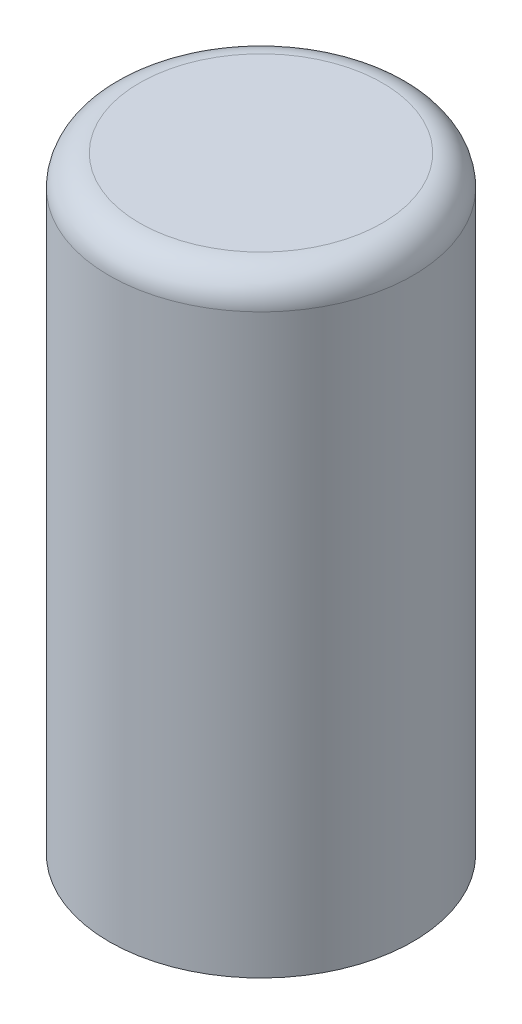
ISO-10303-21;
HEADER;
FILE_DESCRIPTION(('STEP AP214'),'2;1');
FILE_NAME('part.step','',(''),(''),'','','');
FILE_SCHEMA(('AUTOMOTIVE_DESIGN { 1 0 10303 214 1 1 1 1 }'));
ENDSEC;
DATA;
#1=APPLICATION_CONTEXT('core data for automotive mechanical design processes');
#2=APPLICATION_PROTOCOL_DEFINITION('international standard','automotive_design',2000,#1);
#3=PRODUCT_CONTEXT('',#1,'mechanical');
#4=PRODUCT('Part','Part','',(#3));
#5=PRODUCT_RELATED_PRODUCT_CATEGORY('part','',(#4));
#6=PRODUCT_DEFINITION_FORMATION('','',#4);
#7=PRODUCT_DEFINITION_CONTEXT('part definition',#1,'design');
#8=PRODUCT_DEFINITION('design','',#6,#7);
#9=PRODUCT_DEFINITION_SHAPE('','',#8);
#10=(LENGTH_UNIT() NAMED_UNIT(*) SI_UNIT(.MILLI.,.METRE.));
#11=(NAMED_UNIT(*) PLANE_ANGLE_UNIT() SI_UNIT($,.RADIAN.));
#12=(NAMED_UNIT(*) SI_UNIT($,.STERADIAN.) SOLID_ANGLE_UNIT());
#13=UNCERTAINTY_MEASURE_WITH_UNIT(LENGTH_MEASURE(1.E-05),#10,'distance_accuracy_value','');
#14=(GEOMETRIC_REPRESENTATION_CONTEXT(3) GLOBAL_UNCERTAINTY_ASSIGNED_CONTEXT((#13)) GLOBAL_UNIT_ASSIGNED_CONTEXT((#10,
#11,#12)) REPRESENTATION_CONTEXT('',''));
#15=CARTESIAN_POINT('',(0.,0.,0.));
#16=DIRECTION('',(0.,0.,1.));
#17=DIRECTION('',(1.,0.,0.));
#18=AXIS2_PLACEMENT_3D('',#15,#16,#17);
#19=CARTESIAN_POINT('',(-1.44,15.,0.));
#20=DIRECTION('',(-1.,0.,0.));
#21=DIRECTION('',(0.,0.,1.));
#22=AXIS2_PLACEMENT_3D('',#19,#20,#21);
#23=PLANE('',#22);
#24=DIRECTION('',(0.,0.,1.));
#25=VECTOR('',#24,1.);
#26=CARTESIAN_POINT('',(-1.44,3.,0.));
#27=LINE('',#26,#25);
#28=CARTESIAN_POINT('',(-1.44,3.,-2.6886613769681));
#29=VERTEX_POINT('',#28);
#30=CARTESIAN_POINT('',(-1.44,3.,2.6886613769681));
#31=VERTEX_POINT('',#30);
#32=EDGE_CURVE('E59',#29,#31,#27,.T.);
#33=ORIENTED_EDGE('',*,*,#32,.F.);
#34=DIRECTION('',(0.,-1.,0.));
#35=VECTOR('',#34,1.);
#36=CARTESIAN_POINT('',(-1.44,15.,-2.6886613769681));
#37=LINE('',#36,#35);
#38=CARTESIAN_POINT('',(-1.44,15.,-2.6886613769681));
#39=VERTEX_POINT('',#38);
#40=EDGE_CURVE('E66',#39,#29,#37,.T.);
#41=ORIENTED_EDGE('',*,*,#40,.F.);
#42=DIRECTION('',(0.,0.,-1.));
#43=VECTOR('',#42,1.);
#44=CARTESIAN_POINT('',(-1.44,15.,0.));
#45=LINE('',#44,#43);
#46=CARTESIAN_POINT('',(-1.44,15.,2.6886613769681));
#47=VERTEX_POINT('',#46);
#48=EDGE_CURVE('E69',#47,#39,#45,.T.);
#49=ORIENTED_EDGE('',*,*,#48,.F.);
#50=DIRECTION('',(0.,-1.,0.));
#51=VECTOR('',#50,1.);
#52=CARTESIAN_POINT('',(-1.44,15.,2.6886613769681));
#53=LINE('',#52,#51);
#54=EDGE_CURVE('E53',#47,#31,#53,.T.);
#55=ORIENTED_EDGE('',*,*,#54,.T.);
#56=EDGE_LOOP('',(#33,#41,#49,#55));
#57=FACE_BOUND('',#56,.T.);
#58=ADVANCED_FACE('F32',(#57),#23,.F.);
#59=CARTESIAN_POINT('',(0.,20.,0.));
#60=DIRECTION('',(0.,-1.,0.));
#61=DIRECTION('',(0.,0.,-1.));
#62=AXIS2_PLACEMENT_3D('',#59,#60,#61);
#63=CYLINDRICAL_SURFACE('',#62,5.);
#64=CARTESIAN_POINT('',(0.,19.,0.));
#65=DIRECTION('',(0.,1.,0.));
#66=DIRECTION('',(0.,0.,1.));
#67=AXIS2_PLACEMENT_3D('',#64,#65,#66);
#68=CIRCLE('',#67,5.);
#69=CARTESIAN_POINT('',(0.,19.,5.));
#70=VERTEX_POINT('',#69);
#71=EDGE_CURVE('E11',#70,#70,#68,.F.);
#72=ORIENTED_EDGE('',*,*,#71,.T.);
#73=EDGE_LOOP('',(#72));
#74=FACE_BOUND('',#73,.T.);
#75=CARTESIAN_POINT('',(0.,0.,0.));
#76=DIRECTION('',(0.,1.,0.));
#77=DIRECTION('',(0.,0.,1.));
#78=AXIS2_PLACEMENT_3D('',#75,#76,#77);
#79=CIRCLE('',#78,5.);
#80=CARTESIAN_POINT('',(0.,0.,5.));
#81=VERTEX_POINT('',#80);
#82=EDGE_CURVE('E71',#81,#81,#79,.T.);
#83=ORIENTED_EDGE('',*,*,#82,.T.);
#84=EDGE_LOOP('',(#83));
#85=FACE_BOUND('',#84,.T.);
#86=ADVANCED_FACE('F98',(#74,#85),#63,.T.);
#87=CARTESIAN_POINT('',(0.,20.,0.));
#88=DIRECTION('',(0.,1.,0.));
#89=DIRECTION('',(0.,0.,1.));
#90=AXIS2_PLACEMENT_3D('',#87,#88,#89);
#91=PLANE('',#90);
#92=CARTESIAN_POINT('',(0.,20.,0.));
#93=DIRECTION('',(0.,1.,0.));
#94=DIRECTION('',(0.,0.,1.));
#95=AXIS2_PLACEMENT_3D('',#92,#93,#94);
#96=CIRCLE('',#95,4.);
#97=CARTESIAN_POINT('',(0.,20.,4.));
#98=VERTEX_POINT('',#97);
#99=EDGE_CURVE('E40',#98,#98,#96,.T.);
#100=ORIENTED_EDGE('',*,*,#99,.T.);
#101=EDGE_LOOP('',(#100));
#102=FACE_BOUND('',#101,.T.);
#103=ADVANCED_FACE('F82',(#102),#91,.T.);
#104=CARTESIAN_POINT('',(0.,0.,0.));
#105=DIRECTION('',(0.,1.,0.));
#106=DIRECTION('',(0.,0.,1.));
#107=AXIS2_PLACEMENT_3D('',#104,#105,#106);
#108=PLANE('',#107);
#109=CARTESIAN_POINT('',(0.,0.,0.));
#110=DIRECTION('',(0.,-1.,0.));
#111=DIRECTION('',(0.,0.,-1.));
#112=AXIS2_PLACEMENT_3D('',#109,#110,#111);
#113=CIRCLE('',#112,3.05);
#114=CARTESIAN_POINT('',(0.,0.,-3.05));
#115=VERTEX_POINT('',#114);
#116=EDGE_CURVE('E63',#115,#115,#113,.T.);
#117=ORIENTED_EDGE('',*,*,#116,.F.);
#118=EDGE_LOOP('',(#117));
#119=FACE_BOUND('',#118,.T.);
#120=ORIENTED_EDGE('',*,*,#82,.F.);
#121=EDGE_LOOP('',(#120));
#122=FACE_BOUND('',#121,.T.);
#123=ADVANCED_FACE('F85',(#119,#122),#108,.F.);
#124=CARTESIAN_POINT('',(0.,19.,0.));
#125=DIRECTION('',(0.,1.,0.));
#126=DIRECTION('',(0.,0.,1.));
#127=AXIS2_PLACEMENT_3D('',#124,#125,#126);
#128=TOROIDAL_SURFACE('',#127,4.,1.);
#129=ORIENTED_EDGE('',*,*,#71,.F.);
#130=EDGE_LOOP('',(#129));
#131=FACE_BOUND('',#130,.T.);
#132=ORIENTED_EDGE('',*,*,#99,.F.);
#133=EDGE_LOOP('',(#132));
#134=FACE_BOUND('',#133,.T.);
#135=ADVANCED_FACE('F34',(#131,#134),#128,.T.);
#136=CARTESIAN_POINT('',(0.,15.,0.));
#137=DIRECTION('',(0.,-1.,0.));
#138=DIRECTION('',(0.,0.,-1.));
#139=AXIS2_PLACEMENT_3D('',#136,#137,#138);
#140=CYLINDRICAL_SURFACE('',#139,3.05);
#141=ORIENTED_EDGE('',*,*,#116,.T.);
#142=EDGE_LOOP('',(#141));
#143=FACE_BOUND('',#142,.T.);
#144=ORIENTED_EDGE('',*,*,#40,.T.);
#145=CARTESIAN_POINT('',(0.,3.,0.));
#146=DIRECTION('',(0.,-1.,0.));
#147=DIRECTION('',(0.,0.,-1.));
#148=AXIS2_PLACEMENT_3D('',#145,#146,#147);
#149=CIRCLE('',#148,3.05);
#150=EDGE_CURVE('E46',#31,#29,#149,.T.);
#151=ORIENTED_EDGE('',*,*,#150,.F.);
#152=ORIENTED_EDGE('',*,*,#54,.F.);
#153=CARTESIAN_POINT('',(0.,15.,0.));
#154=DIRECTION('',(0.,-1.,0.));
#155=DIRECTION('',(0.,0.,-1.));
#156=AXIS2_PLACEMENT_3D('',#153,#154,#155);
#157=CIRCLE('',#156,3.05);
#158=EDGE_CURVE('E75',#39,#47,#157,.T.);
#159=ORIENTED_EDGE('',*,*,#158,.F.);
#160=EDGE_LOOP('',(#144,#151,#152,#159));
#161=FACE_BOUND('',#160,.T.);
#162=ADVANCED_FACE('F65',(#143,#161),#140,.F.);
#163=CARTESIAN_POINT('',(0.,15.,0.));
#164=DIRECTION('',(0.,-1.,0.));
#165=DIRECTION('',(0.,0.,-1.));
#166=AXIS2_PLACEMENT_3D('',#163,#164,#165);
#167=PLANE('',#166);
#168=ORIENTED_EDGE('',*,*,#48,.T.);
#169=ORIENTED_EDGE('',*,*,#158,.T.);
#170=EDGE_LOOP('',(#168,#169));
#171=FACE_BOUND('',#170,.T.);
#172=ADVANCED_FACE('F91',(#171),#167,.T.);
#173=CARTESIAN_POINT('',(0.,3.,0.));
#174=DIRECTION('',(0.,-1.,0.));
#175=DIRECTION('',(0.,0.,-1.));
#176=AXIS2_PLACEMENT_3D('',#173,#174,#175);
#177=PLANE('',#176);
#178=ORIENTED_EDGE('',*,*,#32,.T.);
#179=ORIENTED_EDGE('',*,*,#150,.T.);
#180=EDGE_LOOP('',(#178,#179));
#181=FACE_BOUND('',#180,.T.);
#182=ADVANCED_FACE('F60',(#181),#177,.T.);
#183=CLOSED_SHELL('',(#58,#86,#103,#123,#135,#162,#172,#182));
#184=MANIFOLD_SOLID_BREP('B2',#183);
#185=ADVANCED_BREP_SHAPE_REPRESENTATION('',(#18,#184),#14);
#186=SHAPE_DEFINITION_REPRESENTATION(#9,#185);
ENDSEC;
END-ISO-10303-21;
